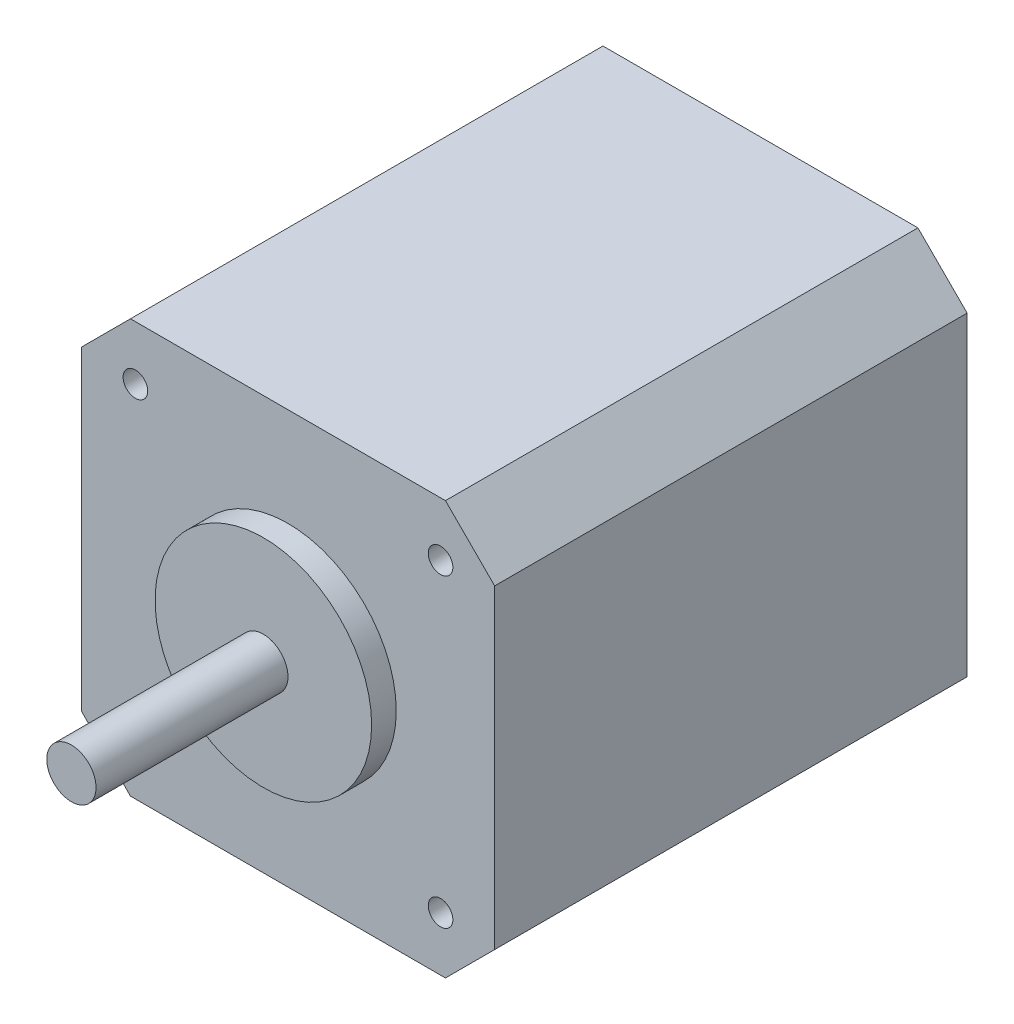
ISO-10303-21;
HEADER;
FILE_DESCRIPTION(('STEP AP214'),'2;1');
FILE_NAME('part.step','',(''),(''),'','','');
FILE_SCHEMA(('AUTOMOTIVE_DESIGN { 1 0 10303 214 1 1 1 1 }'));
ENDSEC;
DATA;
#1=APPLICATION_CONTEXT('core data for automotive mechanical design processes');
#2=APPLICATION_PROTOCOL_DEFINITION('international standard','automotive_design',2000,#1);
#3=PRODUCT_CONTEXT('',#1,'mechanical');
#4=PRODUCT('Part','Part','',(#3));
#5=PRODUCT_RELATED_PRODUCT_CATEGORY('part','',(#4));
#6=PRODUCT_DEFINITION_FORMATION('','',#4);
#7=PRODUCT_DEFINITION_CONTEXT('part definition',#1,'design');
#8=PRODUCT_DEFINITION('design','',#6,#7);
#9=PRODUCT_DEFINITION_SHAPE('','',#8);
#10=(LENGTH_UNIT() NAMED_UNIT(*) SI_UNIT(.MILLI.,.METRE.));
#11=(NAMED_UNIT(*) PLANE_ANGLE_UNIT() SI_UNIT($,.RADIAN.));
#12=(NAMED_UNIT(*) SI_UNIT($,.STERADIAN.) SOLID_ANGLE_UNIT());
#13=UNCERTAINTY_MEASURE_WITH_UNIT(LENGTH_MEASURE(1.E-05),#10,'distance_accuracy_value','');
#14=(GEOMETRIC_REPRESENTATION_CONTEXT(3) GLOBAL_UNCERTAINTY_ASSIGNED_CONTEXT((#13)) GLOBAL_UNIT_ASSIGNED_CONTEXT((#10,
#11,#12)) REPRESENTATION_CONTEXT('',''));
#15=CARTESIAN_POINT('',(0.,0.,0.));
#16=DIRECTION('',(0.,0.,1.));
#17=DIRECTION('',(1.,0.,0.));
#18=AXIS2_PLACEMENT_3D('',#15,#16,#17);
#19=CARTESIAN_POINT('',(-16.,21.,24.));
#20=DIRECTION('',(0.,-1.,0.));
#21=DIRECTION('',(0.,0.,-1.));
#22=AXIS2_PLACEMENT_3D('',#19,#20,#21);
#23=PLANE('',#22);
#24=DIRECTION('',(-1.,0.,0.));
#25=VECTOR('',#24,1.);
#26=CARTESIAN_POINT('',(-16.,21.,-24.));
#27=LINE('',#26,#25);
#28=CARTESIAN_POINT('',(16.,21.,-24.));
#29=VERTEX_POINT('',#28);
#30=CARTESIAN_POINT('',(-16.,21.,-24.));
#31=VERTEX_POINT('',#30);
#32=EDGE_CURVE('E156',#29,#31,#27,.T.);
#33=ORIENTED_EDGE('',*,*,#32,.T.);
#34=DIRECTION('',(0.,0.,-1.));
#35=VECTOR('',#34,1.);
#36=CARTESIAN_POINT('',(-16.,21.,24.));
#37=LINE('',#36,#35);
#38=CARTESIAN_POINT('',(-16.,21.,24.));
#39=VERTEX_POINT('',#38);
#40=EDGE_CURVE('E58',#39,#31,#37,.T.);
#41=ORIENTED_EDGE('',*,*,#40,.F.);
#42=DIRECTION('',(-1.,0.,0.));
#43=VECTOR('',#42,1.);
#44=CARTESIAN_POINT('',(-16.,21.,24.));
#45=LINE('',#44,#43);
#46=CARTESIAN_POINT('',(16.,21.,24.));
#47=VERTEX_POINT('',#46);
#48=EDGE_CURVE('E171',#47,#39,#45,.T.);
#49=ORIENTED_EDGE('',*,*,#48,.F.);
#50=DIRECTION('',(0.,0.,-1.));
#51=VECTOR('',#50,1.);
#52=CARTESIAN_POINT('',(16.,21.,24.));
#53=LINE('',#52,#51);
#54=EDGE_CURVE('E152',#47,#29,#53,.T.);
#55=ORIENTED_EDGE('',*,*,#54,.T.);
#56=EDGE_LOOP('',(#33,#41,#49,#55));
#57=FACE_BOUND('',#56,.T.);
#58=ADVANCED_FACE('F55',(#57),#23,.F.);
#59=CARTESIAN_POINT('',(-21.,16.,24.));
#60=DIRECTION('',(0.707106781186548,-0.707106781186548,0.));
#61=DIRECTION('',(0.707106781186548,0.707106781186548,0.));
#62=AXIS2_PLACEMENT_3D('',#59,#60,#61);
#63=PLANE('',#62);
#64=DIRECTION('',(-0.707106781186547,-0.707106781186547,0.));
#65=VECTOR('',#64,1.);
#66=CARTESIAN_POINT('',(-21.,16.,-24.));
#67=LINE('',#66,#65);
#68=CARTESIAN_POINT('',(-21.,16.,-24.));
#69=VERTEX_POINT('',#68);
#70=EDGE_CURVE('E159',#31,#69,#67,.T.);
#71=ORIENTED_EDGE('',*,*,#70,.T.);
#72=DIRECTION('',(0.,0.,-1.));
#73=VECTOR('',#72,1.);
#74=CARTESIAN_POINT('',(-21.,16.,24.));
#75=LINE('',#74,#73);
#76=CARTESIAN_POINT('',(-21.,16.,24.));
#77=VERTEX_POINT('',#76);
#78=EDGE_CURVE('E180',#77,#69,#75,.T.);
#79=ORIENTED_EDGE('',*,*,#78,.F.);
#80=DIRECTION('',(-0.707106781186547,-0.707106781186547,0.));
#81=VECTOR('',#80,1.);
#82=CARTESIAN_POINT('',(-21.,16.,24.));
#83=LINE('',#82,#81);
#84=EDGE_CURVE('E117',#39,#77,#83,.T.);
#85=ORIENTED_EDGE('',*,*,#84,.F.);
#86=ORIENTED_EDGE('',*,*,#40,.T.);
#87=EDGE_LOOP('',(#71,#79,#85,#86));
#88=FACE_BOUND('',#87,.T.);
#89=ADVANCED_FACE('F186',(#88),#63,.F.);
#90=CARTESIAN_POINT('',(-21.,16.,24.));
#91=DIRECTION('',(1.,0.,0.));
#92=DIRECTION('',(0.,0.,-1.));
#93=AXIS2_PLACEMENT_3D('',#90,#91,#92);
#94=PLANE('',#93);
#95=DIRECTION('',(0.,-1.,0.));
#96=VECTOR('',#95,1.);
#97=CARTESIAN_POINT('',(-21.,16.,-24.));
#98=LINE('',#97,#96);
#99=CARTESIAN_POINT('',(-21.,-16.,-24.));
#100=VERTEX_POINT('',#99);
#101=EDGE_CURVE('E162',#69,#100,#98,.T.);
#102=ORIENTED_EDGE('',*,*,#101,.T.);
#103=DIRECTION('',(0.,0.,-1.));
#104=VECTOR('',#103,1.);
#105=CARTESIAN_POINT('',(-21.,-16.,24.));
#106=LINE('',#105,#104);
#107=CARTESIAN_POINT('',(-21.,-16.,24.));
#108=VERTEX_POINT('',#107);
#109=EDGE_CURVE('E178',#108,#100,#106,.T.);
#110=ORIENTED_EDGE('',*,*,#109,.F.);
#111=DIRECTION('',(0.,-1.,0.));
#112=VECTOR('',#111,1.);
#113=CARTESIAN_POINT('',(-21.,16.,24.));
#114=LINE('',#113,#112);
#115=EDGE_CURVE('E201',#77,#108,#114,.T.);
#116=ORIENTED_EDGE('',*,*,#115,.F.);
#117=ORIENTED_EDGE('',*,*,#78,.T.);
#118=EDGE_LOOP('',(#102,#110,#116,#117));
#119=FACE_BOUND('',#118,.T.);
#120=ADVANCED_FACE('F195',(#119),#94,.F.);
#121=CARTESIAN_POINT('',(-21.,-16.,24.));
#122=DIRECTION('',(0.707106781186548,0.707106781186548,0.));
#123=DIRECTION('',(-0.707106781186548,0.707106781186548,0.));
#124=AXIS2_PLACEMENT_3D('',#121,#122,#123);
#125=PLANE('',#124);
#126=DIRECTION('',(0.707106781186547,-0.707106781186547,0.));
#127=VECTOR('',#126,1.);
#128=CARTESIAN_POINT('',(-21.,-16.,-24.));
#129=LINE('',#128,#127);
#130=CARTESIAN_POINT('',(-16.,-21.,-24.));
#131=VERTEX_POINT('',#130);
#132=EDGE_CURVE('E164',#100,#131,#129,.T.);
#133=ORIENTED_EDGE('',*,*,#132,.T.);
#134=DIRECTION('',(0.,0.,-1.));
#135=VECTOR('',#134,1.);
#136=CARTESIAN_POINT('',(-16.,-21.,24.));
#137=LINE('',#136,#135);
#138=CARTESIAN_POINT('',(-16.,-21.,24.));
#139=VERTEX_POINT('',#138);
#140=EDGE_CURVE('E175',#139,#131,#137,.T.);
#141=ORIENTED_EDGE('',*,*,#140,.F.);
#142=DIRECTION('',(0.707106781186547,-0.707106781186547,0.));
#143=VECTOR('',#142,1.);
#144=CARTESIAN_POINT('',(-21.,-16.,24.));
#145=LINE('',#144,#143);
#146=EDGE_CURVE('E200',#108,#139,#145,.T.);
#147=ORIENTED_EDGE('',*,*,#146,.F.);
#148=ORIENTED_EDGE('',*,*,#109,.T.);
#149=EDGE_LOOP('',(#133,#141,#147,#148));
#150=FACE_BOUND('',#149,.T.);
#151=ADVANCED_FACE('F198',(#150),#125,.F.);
#152=CARTESIAN_POINT('',(-16.,-21.,24.));
#153=DIRECTION('',(0.,1.,0.));
#154=DIRECTION('',(-1.,0.,0.));
#155=AXIS2_PLACEMENT_3D('',#152,#153,#154);
#156=PLANE('',#155);
#157=DIRECTION('',(1.,0.,0.));
#158=VECTOR('',#157,1.);
#159=CARTESIAN_POINT('',(-16.,-21.,-24.));
#160=LINE('',#159,#158);
#161=CARTESIAN_POINT('',(16.,-21.,-24.));
#162=VERTEX_POINT('',#161);
#163=EDGE_CURVE('E166',#131,#162,#160,.T.);
#164=ORIENTED_EDGE('',*,*,#163,.T.);
#165=DIRECTION('',(0.,0.,-1.));
#166=VECTOR('',#165,1.);
#167=CARTESIAN_POINT('',(16.,-21.,24.));
#168=LINE('',#167,#166);
#169=CARTESIAN_POINT('',(16.,-21.,24.));
#170=VERTEX_POINT('',#169);
#171=EDGE_CURVE('E147',#170,#162,#168,.T.);
#172=ORIENTED_EDGE('',*,*,#171,.F.);
#173=DIRECTION('',(1.,0.,0.));
#174=VECTOR('',#173,1.);
#175=CARTESIAN_POINT('',(-16.,-21.,24.));
#176=LINE('',#175,#174);
#177=EDGE_CURVE('E138',#139,#170,#176,.T.);
#178=ORIENTED_EDGE('',*,*,#177,.F.);
#179=ORIENTED_EDGE('',*,*,#140,.T.);
#180=EDGE_LOOP('',(#164,#172,#178,#179));
#181=FACE_BOUND('',#180,.T.);
#182=ADVANCED_FACE('F281',(#181),#156,.F.);
#183=CARTESIAN_POINT('',(21.,-16.,24.));
#184=DIRECTION('',(-0.707106781186547,0.707106781186547,0.));
#185=DIRECTION('',(-0.707106781186548,-0.707106781186548,0.));
#186=AXIS2_PLACEMENT_3D('',#183,#184,#185);
#187=PLANE('',#186);
#188=DIRECTION('',(0.707106781186548,0.707106781186548,0.));
#189=VECTOR('',#188,1.);
#190=CARTESIAN_POINT('',(21.,-16.,-24.));
#191=LINE('',#190,#189);
#192=CARTESIAN_POINT('',(21.,-16.,-24.));
#193=VERTEX_POINT('',#192);
#194=EDGE_CURVE('E146',#162,#193,#191,.T.);
#195=ORIENTED_EDGE('',*,*,#194,.T.);
#196=DIRECTION('',(0.,0.,-1.));
#197=VECTOR('',#196,1.);
#198=CARTESIAN_POINT('',(21.,-16.,24.));
#199=LINE('',#198,#197);
#200=CARTESIAN_POINT('',(21.,-16.,24.));
#201=VERTEX_POINT('',#200);
#202=EDGE_CURVE('E143',#201,#193,#199,.T.);
#203=ORIENTED_EDGE('',*,*,#202,.F.);
#204=DIRECTION('',(0.707106781186548,0.707106781186548,0.));
#205=VECTOR('',#204,1.);
#206=CARTESIAN_POINT('',(21.,-16.,24.));
#207=LINE('',#206,#205);
#208=EDGE_CURVE('E132',#170,#201,#207,.T.);
#209=ORIENTED_EDGE('',*,*,#208,.F.);
#210=ORIENTED_EDGE('',*,*,#171,.T.);
#211=EDGE_LOOP('',(#195,#203,#209,#210));
#212=FACE_BOUND('',#211,.T.);
#213=ADVANCED_FACE('F144',(#212),#187,.F.);
#214=CARTESIAN_POINT('',(21.,16.,24.));
#215=DIRECTION('',(-1.,0.,0.));
#216=DIRECTION('',(0.,-1.,0.));
#217=AXIS2_PLACEMENT_3D('',#214,#215,#216);
#218=PLANE('',#217);
#219=DIRECTION('',(0.,1.,0.));
#220=VECTOR('',#219,1.);
#221=CARTESIAN_POINT('',(21.,16.,-24.));
#222=LINE('',#221,#220);
#223=CARTESIAN_POINT('',(21.,16.,-24.));
#224=VERTEX_POINT('',#223);
#225=EDGE_CURVE('E102',#193,#224,#222,.T.);
#226=ORIENTED_EDGE('',*,*,#225,.T.);
#227=DIRECTION('',(0.,0.,-1.));
#228=VECTOR('',#227,1.);
#229=CARTESIAN_POINT('',(21.,16.,24.));
#230=LINE('',#229,#228);
#231=CARTESIAN_POINT('',(21.,16.,24.));
#232=VERTEX_POINT('',#231);
#233=EDGE_CURVE('E148',#232,#224,#230,.T.);
#234=ORIENTED_EDGE('',*,*,#233,.F.);
#235=DIRECTION('',(0.,1.,0.));
#236=VECTOR('',#235,1.);
#237=CARTESIAN_POINT('',(21.,16.,24.));
#238=LINE('',#237,#236);
#239=EDGE_CURVE('E136',#201,#232,#238,.T.);
#240=ORIENTED_EDGE('',*,*,#239,.F.);
#241=ORIENTED_EDGE('',*,*,#202,.T.);
#242=EDGE_LOOP('',(#226,#234,#240,#241));
#243=FACE_BOUND('',#242,.T.);
#244=ADVANCED_FACE('F150',(#243),#218,.F.);
#245=CARTESIAN_POINT('',(16.,21.,24.));
#246=DIRECTION('',(-0.707106781186547,-0.707106781186548,0.));
#247=DIRECTION('',(0.707106781186548,-0.707106781186547,0.));
#248=AXIS2_PLACEMENT_3D('',#245,#246,#247);
#249=PLANE('',#248);
#250=DIRECTION('',(-0.707106781186548,0.707106781186547,0.));
#251=VECTOR('',#250,1.);
#252=CARTESIAN_POINT('',(16.,21.,-24.));
#253=LINE('',#252,#251);
#254=EDGE_CURVE('E108',#224,#29,#253,.T.);
#255=ORIENTED_EDGE('',*,*,#254,.T.);
#256=ORIENTED_EDGE('',*,*,#54,.F.);
#257=DIRECTION('',(-0.707106781186548,0.707106781186547,0.));
#258=VECTOR('',#257,1.);
#259=CARTESIAN_POINT('',(16.,21.,24.));
#260=LINE('',#259,#258);
#261=EDGE_CURVE('E72',#232,#47,#260,.T.);
#262=ORIENTED_EDGE('',*,*,#261,.F.);
#263=ORIENTED_EDGE('',*,*,#233,.T.);
#264=EDGE_LOOP('',(#255,#256,#262,#263));
#265=FACE_BOUND('',#264,.T.);
#266=ADVANCED_FACE('F244',(#265),#249,.F.);
#267=CARTESIAN_POINT('',(0.,0.,24.));
#268=DIRECTION('',(0.,0.,-1.));
#269=DIRECTION('',(-1.,0.,0.));
#270=AXIS2_PLACEMENT_3D('',#267,#268,#269);
#271=PLANE('',#270);
#272=CARTESIAN_POINT('',(-15.4999999999998,15.5,24.));
#273=DIRECTION('',(0.,0.,1.));
#274=DIRECTION('',(1.,0.,0.));
#275=AXIS2_PLACEMENT_3D('',#272,#273,#274);
#276=CIRCLE('',#275,1.25);
#277=CARTESIAN_POINT('',(-14.2499999999998,15.5,24.));
#278=VERTEX_POINT('',#277);
#279=EDGE_CURVE('E236',#278,#278,#276,.T.);
#280=ORIENTED_EDGE('',*,*,#279,.F.);
#281=EDGE_LOOP('',(#280));
#282=FACE_BOUND('',#281,.T.);
#283=CARTESIAN_POINT('',(15.4999999999998,15.5,24.));
#284=DIRECTION('',(0.,0.,1.));
#285=DIRECTION('',(1.,0.,0.));
#286=AXIS2_PLACEMENT_3D('',#283,#284,#285);
#287=CIRCLE('',#286,1.25);
#288=CARTESIAN_POINT('',(16.7499999999998,15.5,24.));
#289=VERTEX_POINT('',#288);
#290=EDGE_CURVE('E230',#289,#289,#287,.T.);
#291=ORIENTED_EDGE('',*,*,#290,.F.);
#292=EDGE_LOOP('',(#291));
#293=FACE_BOUND('',#292,.T.);
#294=CARTESIAN_POINT('',(15.4999999999998,-15.5,24.));
#295=DIRECTION('',(0.,0.,1.));
#296=DIRECTION('',(1.,0.,0.));
#297=AXIS2_PLACEMENT_3D('',#294,#295,#296);
#298=CIRCLE('',#297,1.25);
#299=CARTESIAN_POINT('',(16.7499999999998,-15.5,24.));
#300=VERTEX_POINT('',#299);
#301=EDGE_CURVE('E224',#300,#300,#298,.T.);
#302=ORIENTED_EDGE('',*,*,#301,.F.);
#303=EDGE_LOOP('',(#302));
#304=FACE_BOUND('',#303,.T.);
#305=CARTESIAN_POINT('',(-15.4999999999998,-15.5,24.));
#306=DIRECTION('',(0.,0.,1.));
#307=DIRECTION('',(1.,0.,0.));
#308=AXIS2_PLACEMENT_3D('',#305,#306,#307);
#309=CIRCLE('',#308,1.25);
#310=CARTESIAN_POINT('',(-14.2499999999998,-15.5,24.));
#311=VERTEX_POINT('',#310);
#312=EDGE_CURVE('E218',#311,#311,#309,.T.);
#313=ORIENTED_EDGE('',*,*,#312,.F.);
#314=EDGE_LOOP('',(#313));
#315=FACE_BOUND('',#314,.T.);
#316=CARTESIAN_POINT('',(0.,0.,24.));
#317=DIRECTION('',(0.,0.,1.));
#318=DIRECTION('',(1.,0.,0.));
#319=AXIS2_PLACEMENT_3D('',#316,#317,#318);
#320=CIRCLE('',#319,11.);
#321=CARTESIAN_POINT('',(11.,0.,24.));
#322=VERTEX_POINT('',#321);
#323=EDGE_CURVE('E11',#322,#322,#320,.T.);
#324=ORIENTED_EDGE('',*,*,#323,.F.);
#325=EDGE_LOOP('',(#324));
#326=FACE_BOUND('',#325,.T.);
#327=ORIENTED_EDGE('',*,*,#48,.T.);
#328=ORIENTED_EDGE('',*,*,#84,.T.);
#329=ORIENTED_EDGE('',*,*,#115,.T.);
#330=ORIENTED_EDGE('',*,*,#146,.T.);
#331=ORIENTED_EDGE('',*,*,#177,.T.);
#332=ORIENTED_EDGE('',*,*,#208,.T.);
#333=ORIENTED_EDGE('',*,*,#239,.T.);
#334=ORIENTED_EDGE('',*,*,#261,.T.);
#335=EDGE_LOOP('',(#327,#328,#329,#330,#331,#332,#333,#334));
#336=FACE_BOUND('',#335,.T.);
#337=ADVANCED_FACE('F134',(#282,#293,#304,#315,#326,#336),#271,.F.);
#338=CARTESIAN_POINT('',(0.,0.,-24.));
#339=DIRECTION('',(0.,0.,-1.));
#340=DIRECTION('',(-1.,0.,0.));
#341=AXIS2_PLACEMENT_3D('',#338,#339,#340);
#342=PLANE('',#341);
#343=ORIENTED_EDGE('',*,*,#32,.F.);
#344=ORIENTED_EDGE('',*,*,#254,.F.);
#345=ORIENTED_EDGE('',*,*,#225,.F.);
#346=ORIENTED_EDGE('',*,*,#194,.F.);
#347=ORIENTED_EDGE('',*,*,#163,.F.);
#348=ORIENTED_EDGE('',*,*,#132,.F.);
#349=ORIENTED_EDGE('',*,*,#101,.F.);
#350=ORIENTED_EDGE('',*,*,#70,.F.);
#351=EDGE_LOOP('',(#343,#344,#345,#346,#347,#348,#349,#350));
#352=FACE_BOUND('',#351,.T.);
#353=ADVANCED_FACE('F191',(#352),#342,.T.);
#354=CARTESIAN_POINT('',(0.,0.,26.5));
#355=DIRECTION('',(0.,0.,1.));
#356=DIRECTION('',(1.,0.,0.));
#357=AXIS2_PLACEMENT_3D('',#354,#355,#356);
#358=PLANE('',#357);
#359=CARTESIAN_POINT('',(0.,0.,26.5));
#360=DIRECTION('',(0.,0.,1.));
#361=DIRECTION('',(1.,0.,0.));
#362=AXIS2_PLACEMENT_3D('',#359,#360,#361);
#363=CIRCLE('',#362,11.);
#364=CARTESIAN_POINT('',(11.,0.,26.5));
#365=VERTEX_POINT('',#364);
#366=EDGE_CURVE('E160',#365,#365,#363,.T.);
#367=ORIENTED_EDGE('',*,*,#366,.T.);
#368=EDGE_LOOP('',(#367));
#369=FACE_BOUND('',#368,.T.);
#370=CARTESIAN_POINT('',(0.,0.,26.5));
#371=DIRECTION('',(0.,0.,1.));
#372=DIRECTION('',(1.,0.,0.));
#373=AXIS2_PLACEMENT_3D('',#370,#371,#372);
#374=CIRCLE('',#373,2.5);
#375=CARTESIAN_POINT('',(2.5,0.,26.5));
#376=VERTEX_POINT('',#375);
#377=EDGE_CURVE('E209',#376,#376,#374,.T.);
#378=ORIENTED_EDGE('',*,*,#377,.F.);
#379=EDGE_LOOP('',(#378));
#380=FACE_BOUND('',#379,.T.);
#381=ADVANCED_FACE('F257',(#369,#380),#358,.T.);
#382=CARTESIAN_POINT('',(0.,0.,26.5));
#383=DIRECTION('',(0.,0.,-1.));
#384=DIRECTION('',(-1.,0.,0.));
#385=AXIS2_PLACEMENT_3D('',#382,#383,#384);
#386=CYLINDRICAL_SURFACE('',#385,11.);
#387=ORIENTED_EDGE('',*,*,#366,.F.);
#388=EDGE_LOOP('',(#387));
#389=FACE_BOUND('',#388,.T.);
#390=ORIENTED_EDGE('',*,*,#323,.T.);
#391=EDGE_LOOP('',(#390));
#392=FACE_BOUND('',#391,.T.);
#393=ADVANCED_FACE('F254',(#389,#392),#386,.T.);
#394=CARTESIAN_POINT('',(0.,0.,46.));
#395=DIRECTION('',(0.,0.,-1.));
#396=DIRECTION('',(-1.,0.,0.));
#397=AXIS2_PLACEMENT_3D('',#394,#395,#396);
#398=CYLINDRICAL_SURFACE('',#397,2.5);
#399=ORIENTED_EDGE('',*,*,#377,.T.);
#400=EDGE_LOOP('',(#399));
#401=FACE_BOUND('',#400,.T.);
#402=CARTESIAN_POINT('',(0.,0.,46.));
#403=DIRECTION('',(0.,0.,1.));
#404=DIRECTION('',(1.,0.,0.));
#405=AXIS2_PLACEMENT_3D('',#402,#403,#404);
#406=CIRCLE('',#405,2.5);
#407=CARTESIAN_POINT('',(2.5,0.,46.));
#408=VERTEX_POINT('',#407);
#409=EDGE_CURVE('E212',#408,#408,#406,.T.);
#410=ORIENTED_EDGE('',*,*,#409,.F.);
#411=EDGE_LOOP('',(#410));
#412=FACE_BOUND('',#411,.T.);
#413=ADVANCED_FACE('F256',(#401,#412),#398,.T.);
#414=CARTESIAN_POINT('',(0.,0.,46.));
#415=DIRECTION('',(0.,0.,1.));
#416=DIRECTION('',(1.,0.,0.));
#417=AXIS2_PLACEMENT_3D('',#414,#415,#416);
#418=PLANE('',#417);
#419=ORIENTED_EDGE('',*,*,#409,.T.);
#420=EDGE_LOOP('',(#419));
#421=FACE_BOUND('',#420,.T.);
#422=ADVANCED_FACE('F264',(#421),#418,.T.);
#423=CARTESIAN_POINT('',(-15.4999999999998,-15.5,16.5));
#424=DIRECTION('',(0.,0.,1.));
#425=DIRECTION('',(1.,0.,0.));
#426=AXIS2_PLACEMENT_3D('',#423,#424,#425);
#427=CONICAL_SURFACE('',#426,1.25,1.02974425867665);
#428=CARTESIAN_POINT('',(-15.4999999999998,-15.5,15.7489242262155));
#429=VERTEX_POINT('',#428);
#430=VERTEX_LOOP('',#429);
#431=FACE_BOUND('',#430,.T.);
#432=CARTESIAN_POINT('',(-15.4999999999998,-15.5,16.5));
#433=DIRECTION('',(0.,0.,1.));
#434=DIRECTION('',(1.,0.,0.));
#435=AXIS2_PLACEMENT_3D('',#432,#433,#434);
#436=CIRCLE('',#435,1.25);
#437=CARTESIAN_POINT('',(-14.2499999999998,-15.5,16.5));
#438=VERTEX_POINT('',#437);
#439=EDGE_CURVE('E215',#438,#438,#436,.T.);
#440=ORIENTED_EDGE('',*,*,#439,.T.);
#441=EDGE_LOOP('',(#440));
#442=FACE_BOUND('',#441,.T.);
#443=ADVANCED_FACE('F322',(#431,#442),#427,.F.);
#444=CARTESIAN_POINT('',(-15.4999999999998,-15.5,24.));
#445=DIRECTION('',(0.,0.,1.));
#446=DIRECTION('',(1.,0.,0.));
#447=AXIS2_PLACEMENT_3D('',#444,#445,#446);
#448=CYLINDRICAL_SURFACE('',#447,1.25);
#449=ORIENTED_EDGE('',*,*,#439,.F.);
#450=EDGE_LOOP('',(#449));
#451=FACE_BOUND('',#450,.T.);
#452=ORIENTED_EDGE('',*,*,#312,.T.);
#453=EDGE_LOOP('',(#452));
#454=FACE_BOUND('',#453,.T.);
#455=ADVANCED_FACE('F332',(#451,#454),#448,.F.);
#456=CARTESIAN_POINT('',(15.4999999999998,-15.5,16.5));
#457=DIRECTION('',(0.,0.,1.));
#458=DIRECTION('',(1.,0.,0.));
#459=AXIS2_PLACEMENT_3D('',#456,#457,#458);
#460=CONICAL_SURFACE('',#459,1.25,1.02974425867665);
#461=CARTESIAN_POINT('',(15.4999999999998,-15.5,15.7489242262155));
#462=VERTEX_POINT('',#461);
#463=VERTEX_LOOP('',#462);
#464=FACE_BOUND('',#463,.T.);
#465=CARTESIAN_POINT('',(15.4999999999998,-15.5,16.5));
#466=DIRECTION('',(0.,0.,1.));
#467=DIRECTION('',(1.,0.,0.));
#468=AXIS2_PLACEMENT_3D('',#465,#466,#467);
#469=CIRCLE('',#468,1.25);
#470=CARTESIAN_POINT('',(16.7499999999998,-15.5,16.5));
#471=VERTEX_POINT('',#470);
#472=EDGE_CURVE('E221',#471,#471,#469,.T.);
#473=ORIENTED_EDGE('',*,*,#472,.T.);
#474=EDGE_LOOP('',(#473));
#475=FACE_BOUND('',#474,.T.);
#476=ADVANCED_FACE('F343',(#464,#475),#460,.F.);
#477=CARTESIAN_POINT('',(15.4999999999998,-15.5,24.));
#478=DIRECTION('',(0.,0.,1.));
#479=DIRECTION('',(1.,0.,0.));
#480=AXIS2_PLACEMENT_3D('',#477,#478,#479);
#481=CYLINDRICAL_SURFACE('',#480,1.25);
#482=ORIENTED_EDGE('',*,*,#472,.F.);
#483=EDGE_LOOP('',(#482));
#484=FACE_BOUND('',#483,.T.);
#485=ORIENTED_EDGE('',*,*,#301,.T.);
#486=EDGE_LOOP('',(#485));
#487=FACE_BOUND('',#486,.T.);
#488=ADVANCED_FACE('F354',(#484,#487),#481,.F.);
#489=CARTESIAN_POINT('',(15.4999999999998,15.5,16.5));
#490=DIRECTION('',(0.,0.,1.));
#491=DIRECTION('',(1.,0.,0.));
#492=AXIS2_PLACEMENT_3D('',#489,#490,#491);
#493=CONICAL_SURFACE('',#492,1.25,1.02974425867665);
#494=CARTESIAN_POINT('',(15.4999999999998,15.5,15.7489242262155));
#495=VERTEX_POINT('',#494);
#496=VERTEX_LOOP('',#495);
#497=FACE_BOUND('',#496,.T.);
#498=CARTESIAN_POINT('',(15.4999999999998,15.5,16.5));
#499=DIRECTION('',(0.,0.,1.));
#500=DIRECTION('',(1.,0.,0.));
#501=AXIS2_PLACEMENT_3D('',#498,#499,#500);
#502=CIRCLE('',#501,1.25);
#503=CARTESIAN_POINT('',(16.7499999999998,15.5,16.5));
#504=VERTEX_POINT('',#503);
#505=EDGE_CURVE('E227',#504,#504,#502,.T.);
#506=ORIENTED_EDGE('',*,*,#505,.T.);
#507=EDGE_LOOP('',(#506));
#508=FACE_BOUND('',#507,.T.);
#509=ADVANCED_FACE('F365',(#497,#508),#493,.F.);
#510=CARTESIAN_POINT('',(15.4999999999998,15.5,24.));
#511=DIRECTION('',(0.,0.,1.));
#512=DIRECTION('',(1.,0.,0.));
#513=AXIS2_PLACEMENT_3D('',#510,#511,#512);
#514=CYLINDRICAL_SURFACE('',#513,1.25);
#515=ORIENTED_EDGE('',*,*,#505,.F.);
#516=EDGE_LOOP('',(#515));
#517=FACE_BOUND('',#516,.T.);
#518=ORIENTED_EDGE('',*,*,#290,.T.);
#519=EDGE_LOOP('',(#518));
#520=FACE_BOUND('',#519,.T.);
#521=ADVANCED_FACE('F376',(#517,#520),#514,.F.);
#522=CARTESIAN_POINT('',(-15.4999999999998,15.5,16.5));
#523=DIRECTION('',(0.,0.,1.));
#524=DIRECTION('',(1.,0.,0.));
#525=AXIS2_PLACEMENT_3D('',#522,#523,#524);
#526=CONICAL_SURFACE('',#525,1.25,1.02974425867665);
#527=CARTESIAN_POINT('',(-15.4999999999998,15.5,15.7489242262155));
#528=VERTEX_POINT('',#527);
#529=VERTEX_LOOP('',#528);
#530=FACE_BOUND('',#529,.T.);
#531=CARTESIAN_POINT('',(-15.4999999999998,15.5,16.5));
#532=DIRECTION('',(0.,0.,1.));
#533=DIRECTION('',(1.,0.,0.));
#534=AXIS2_PLACEMENT_3D('',#531,#532,#533);
#535=CIRCLE('',#534,1.25);
#536=CARTESIAN_POINT('',(-14.2499999999998,15.5,16.5));
#537=VERTEX_POINT('',#536);
#538=EDGE_CURVE('E233',#537,#537,#535,.T.);
#539=ORIENTED_EDGE('',*,*,#538,.T.);
#540=EDGE_LOOP('',(#539));
#541=FACE_BOUND('',#540,.T.);
#542=ADVANCED_FACE('F387',(#530,#541),#526,.F.);
#543=CARTESIAN_POINT('',(-15.4999999999998,15.5,24.));
#544=DIRECTION('',(0.,0.,1.));
#545=DIRECTION('',(1.,0.,0.));
#546=AXIS2_PLACEMENT_3D('',#543,#544,#545);
#547=CYLINDRICAL_SURFACE('',#546,1.25);
#548=ORIENTED_EDGE('',*,*,#538,.F.);
#549=EDGE_LOOP('',(#548));
#550=FACE_BOUND('',#549,.T.);
#551=ORIENTED_EDGE('',*,*,#279,.T.);
#552=EDGE_LOOP('',(#551));
#553=FACE_BOUND('',#552,.T.);
#554=ADVANCED_FACE('F240',(#550,#553),#547,.F.);
#555=CLOSED_SHELL('',(#58,#89,#120,#151,#182,#213,#244,#266,#337,#353,#381,#393,#413,#422,#443,
#455,#476,#488,#509,#521,#542,#554));
#556=MANIFOLD_SOLID_BREP('B2',#555);
#557=ADVANCED_BREP_SHAPE_REPRESENTATION('',(#18,#556),#14);
#558=SHAPE_DEFINITION_REPRESENTATION(#9,#557);
ENDSEC;
END-ISO-10303-21;
